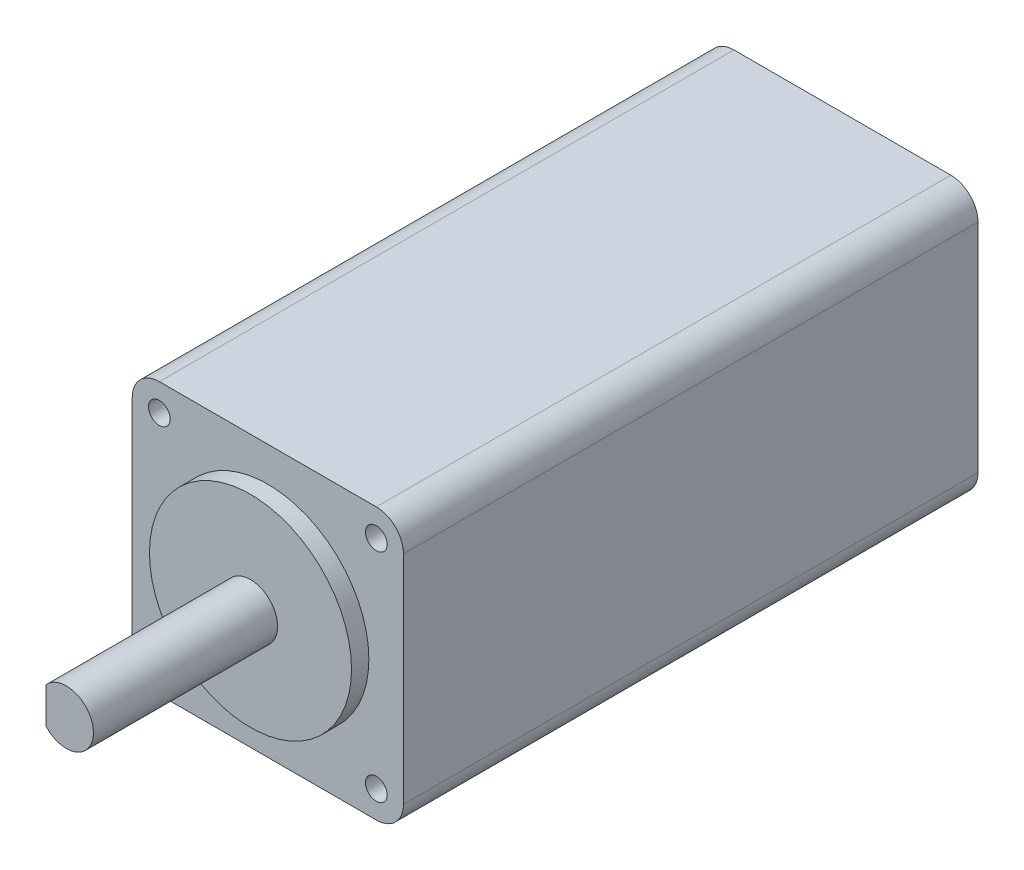
ISO-10303-21;
HEADER;
FILE_DESCRIPTION(('STEP AP214'),'2;1');
FILE_NAME('part.step','',(''),(''),'','','');
FILE_SCHEMA(('AUTOMOTIVE_DESIGN { 1 0 10303 214 1 1 1 1 }'));
ENDSEC;
DATA;
#1=APPLICATION_CONTEXT('core data for automotive mechanical design processes');
#2=APPLICATION_PROTOCOL_DEFINITION('international standard','automotive_design',2000,#1);
#3=PRODUCT_CONTEXT('',#1,'mechanical');
#4=PRODUCT('Part','Part','',(#3));
#5=PRODUCT_RELATED_PRODUCT_CATEGORY('part','',(#4));
#6=PRODUCT_DEFINITION_FORMATION('','',#4);
#7=PRODUCT_DEFINITION_CONTEXT('part definition',#1,'design');
#8=PRODUCT_DEFINITION('design','',#6,#7);
#9=PRODUCT_DEFINITION_SHAPE('','',#8);
#10=(LENGTH_UNIT() NAMED_UNIT(*) SI_UNIT(.MILLI.,.METRE.));
#11=(NAMED_UNIT(*) PLANE_ANGLE_UNIT() SI_UNIT($,.RADIAN.));
#12=(NAMED_UNIT(*) SI_UNIT($,.STERADIAN.) SOLID_ANGLE_UNIT());
#13=UNCERTAINTY_MEASURE_WITH_UNIT(LENGTH_MEASURE(1.E-05),#10,'distance_accuracy_value','');
#14=(GEOMETRIC_REPRESENTATION_CONTEXT(3) GLOBAL_UNCERTAINTY_ASSIGNED_CONTEXT((#13)) GLOBAL_UNIT_ASSIGNED_CONTEXT((#10,
#11,#12)) REPRESENTATION_CONTEXT('',''));
#15=CARTESIAN_POINT('',(0.,0.,0.));
#16=DIRECTION('',(0.,0.,1.));
#17=DIRECTION('',(1.,0.,0.));
#18=AXIS2_PLACEMENT_3D('',#15,#16,#17);
#19=CARTESIAN_POINT('',(-10.,-7.99999999999999,42.37));
#20=DIRECTION('',(1.,0.,0.));
#21=DIRECTION('',(0.,0.,-1.));
#22=AXIS2_PLACEMENT_3D('',#19,#20,#21);
#23=PLANE('',#22);
#24=DIRECTION('',(0.,-1.,0.));
#25=VECTOR('',#24,1.);
#26=CARTESIAN_POINT('',(-10.,-7.99999999999999,0.));
#27=LINE('',#26,#25);
#28=CARTESIAN_POINT('',(-10.,7.99999999999999,0.));
#29=VERTEX_POINT('',#28);
#30=CARTESIAN_POINT('',(-10.,-7.99999999999999,0.));
#31=VERTEX_POINT('',#30);
#32=EDGE_CURVE('E254',#29,#31,#27,.T.);
#33=ORIENTED_EDGE('',*,*,#32,.T.);
#34=DIRECTION('',(0.,0.,-1.));
#35=VECTOR('',#34,1.);
#36=CARTESIAN_POINT('',(-10.,-7.99999999999999,42.37));
#37=LINE('',#36,#35);
#38=CARTESIAN_POINT('',(-10.,-7.99999999999999,42.37));
#39=VERTEX_POINT('',#38);
#40=EDGE_CURVE('E264',#39,#31,#37,.T.);
#41=ORIENTED_EDGE('',*,*,#40,.F.);
#42=DIRECTION('',(0.,-1.,0.));
#43=VECTOR('',#42,1.);
#44=CARTESIAN_POINT('',(-10.,-7.99999999999999,42.37));
#45=LINE('',#44,#43);
#46=CARTESIAN_POINT('',(-10.,7.99999999999999,42.37));
#47=VERTEX_POINT('',#46);
#48=EDGE_CURVE('E237',#47,#39,#45,.T.);
#49=ORIENTED_EDGE('',*,*,#48,.F.);
#50=DIRECTION('',(0.,0.,-1.));
#51=VECTOR('',#50,1.);
#52=CARTESIAN_POINT('',(-10.,7.99999999999999,42.37));
#53=LINE('',#52,#51);
#54=EDGE_CURVE('E267',#47,#29,#53,.T.);
#55=ORIENTED_EDGE('',*,*,#54,.T.);
#56=EDGE_LOOP('',(#33,#41,#49,#55));
#57=FACE_BOUND('',#56,.T.);
#58=DIRECTION('',(0.,-1.,0.));
#59=VECTOR('',#58,1.);
#60=CARTESIAN_POINT('',(-10.,5.8,3.));
#61=LINE('',#60,#59);
#62=CARTESIAN_POINT('',(-10.,5.8,3.));
#63=VERTEX_POINT('',#62);
#64=CARTESIAN_POINT('',(-10.,-5.8,3.));
#65=VERTEX_POINT('',#64);
#66=EDGE_CURVE('E178',#63,#65,#61,.T.);
#67=ORIENTED_EDGE('',*,*,#66,.F.);
#68=DIRECTION('',(0.,0.,-1.));
#69=VECTOR('',#68,1.);
#70=CARTESIAN_POINT('',(-10.,5.8,3.));
#71=LINE('',#70,#69);
#72=CARTESIAN_POINT('',(-10.,5.8,7.9));
#73=VERTEX_POINT('',#72);
#74=EDGE_CURVE('E183',#73,#63,#71,.T.);
#75=ORIENTED_EDGE('',*,*,#74,.F.);
#76=DIRECTION('',(0.,1.,0.));
#77=VECTOR('',#76,1.);
#78=CARTESIAN_POINT('',(-10.,5.8,7.9));
#79=LINE('',#78,#77);
#80=CARTESIAN_POINT('',(-10.,-5.8,7.9));
#81=VERTEX_POINT('',#80);
#82=EDGE_CURVE('E56',#81,#73,#79,.T.);
#83=ORIENTED_EDGE('',*,*,#82,.F.);
#84=DIRECTION('',(0.,0.,1.));
#85=VECTOR('',#84,1.);
#86=CARTESIAN_POINT('',(-10.,-5.8,3.));
#87=LINE('',#86,#85);
#88=EDGE_CURVE('E51',#65,#81,#87,.T.);
#89=ORIENTED_EDGE('',*,*,#88,.F.);
#90=EDGE_LOOP('',(#67,#75,#83,#89));
#91=FACE_BOUND('',#90,.T.);
#92=ADVANCED_FACE('F36',(#57,#91),#23,.F.);
#93=CARTESIAN_POINT('',(0.,0.,43.65));
#94=DIRECTION('',(0.,0.,1.));
#95=DIRECTION('',(1.,0.,0.));
#96=AXIS2_PLACEMENT_3D('',#93,#94,#95);
#97=PLANE('',#96);
#98=CARTESIAN_POINT('',(0.,0.,43.65));
#99=DIRECTION('',(0.,0.,1.));
#100=DIRECTION('',(1.,0.,0.));
#101=AXIS2_PLACEMENT_3D('',#98,#99,#100);
#102=CIRCLE('',#101,7.45);
#103=CARTESIAN_POINT('',(-7.45,0.,43.65));
#104=VERTEX_POINT('',#103);
#105=EDGE_CURVE('E221',#104,#104,#102,.T.);
#106=ORIENTED_EDGE('',*,*,#105,.T.);
#107=EDGE_LOOP('',(#106));
#108=FACE_BOUND('',#107,.T.);
#109=DIRECTION('',(0.,-1.,0.));
#110=VECTOR('',#109,1.);
#111=CARTESIAN_POINT('',(-1.5,1.3228756555323,43.65));
#112=LINE('',#111,#110);
#113=CARTESIAN_POINT('',(-1.5,1.3228756555323,43.65));
#114=VERTEX_POINT('',#113);
#115=CARTESIAN_POINT('',(-1.5,-1.3228756555323,43.65));
#116=VERTEX_POINT('',#115);
#117=EDGE_CURVE('E211',#114,#116,#112,.T.);
#118=ORIENTED_EDGE('',*,*,#117,.F.);
#119=CARTESIAN_POINT('',(0.,0.,43.65));
#120=DIRECTION('',(0.,0.,1.));
#121=DIRECTION('',(1.,0.,0.));
#122=AXIS2_PLACEMENT_3D('',#119,#120,#121);
#123=CIRCLE('',#122,2.);
#124=EDGE_CURVE('E206',#116,#114,#123,.T.);
#125=ORIENTED_EDGE('',*,*,#124,.F.);
#126=EDGE_LOOP('',(#118,#125));
#127=FACE_BOUND('',#126,.T.);
#128=ADVANCED_FACE('F330',(#108,#127),#97,.T.);
#129=CARTESIAN_POINT('',(8.,-8.,42.37));
#130=DIRECTION('',(0.,0.,-1.));
#131=DIRECTION('',(-1.,0.,0.));
#132=AXIS2_PLACEMENT_3D('',#129,#130,#131);
#133=PLANE('',#132);
#134=CARTESIAN_POINT('',(-8.,-8.,42.37));
#135=DIRECTION('',(0.,0.,1.));
#136=DIRECTION('',(1.,0.,0.));
#137=AXIS2_PLACEMENT_3D('',#134,#135,#136);
#138=CIRCLE('',#137,0.79999999999999);
#139=CARTESIAN_POINT('',(-7.20000000000001,-8.,42.37));
#140=VERTEX_POINT('',#139);
#141=EDGE_CURVE('E156',#140,#140,#138,.T.);
#142=ORIENTED_EDGE('',*,*,#141,.F.);
#143=EDGE_LOOP('',(#142));
#144=FACE_BOUND('',#143,.T.);
#145=CARTESIAN_POINT('',(8.,-8.,42.37));
#146=DIRECTION('',(0.,0.,1.));
#147=DIRECTION('',(1.,0.,0.));
#148=AXIS2_PLACEMENT_3D('',#145,#146,#147);
#149=CIRCLE('',#148,0.79999999999999);
#150=CARTESIAN_POINT('',(8.79999999999999,-8.,42.37));
#151=VERTEX_POINT('',#150);
#152=EDGE_CURVE('E155',#151,#151,#149,.T.);
#153=ORIENTED_EDGE('',*,*,#152,.F.);
#154=EDGE_LOOP('',(#153));
#155=FACE_BOUND('',#154,.T.);
#156=CARTESIAN_POINT('',(8.,8.,42.37));
#157=DIRECTION('',(0.,0.,1.));
#158=DIRECTION('',(1.,0.,0.));
#159=AXIS2_PLACEMENT_3D('',#156,#157,#158);
#160=CIRCLE('',#159,0.79999999999999);
#161=CARTESIAN_POINT('',(8.79999999999999,8.,42.37));
#162=VERTEX_POINT('',#161);
#163=EDGE_CURVE('E166',#162,#162,#160,.T.);
#164=ORIENTED_EDGE('',*,*,#163,.F.);
#165=EDGE_LOOP('',(#164));
#166=FACE_BOUND('',#165,.T.);
#167=CARTESIAN_POINT('',(-8.,8.,42.37));
#168=DIRECTION('',(0.,0.,1.));
#169=DIRECTION('',(1.,0.,0.));
#170=AXIS2_PLACEMENT_3D('',#167,#168,#169);
#171=CIRCLE('',#170,0.79999999999999);
#172=CARTESIAN_POINT('',(-7.20000000000001,8.,42.37));
#173=VERTEX_POINT('',#172);
#174=EDGE_CURVE('E172',#173,#173,#171,.T.);
#175=ORIENTED_EDGE('',*,*,#174,.F.);
#176=EDGE_LOOP('',(#175));
#177=FACE_BOUND('',#176,.T.);
#178=CARTESIAN_POINT('',(8.,-8.,42.37));
#179=DIRECTION('',(0.,0.,1.));
#180=DIRECTION('',(-1.,0.,0.));
#181=AXIS2_PLACEMENT_3D('',#178,#179,#180);
#182=CIRCLE('',#181,2.);
#183=CARTESIAN_POINT('',(7.99999999999998,-10.,42.37));
#184=VERTEX_POINT('',#183);
#185=CARTESIAN_POINT('',(10.,-7.99999999999999,42.37));
#186=VERTEX_POINT('',#185);
#187=EDGE_CURVE('E225',#184,#186,#182,.T.);
#188=ORIENTED_EDGE('',*,*,#187,.T.);
#189=DIRECTION('',(0.,1.,0.));
#190=VECTOR('',#189,1.);
#191=CARTESIAN_POINT('',(10.,-7.99999999999999,42.37));
#192=LINE('',#191,#190);
#193=CARTESIAN_POINT('',(10.,7.99999999999999,42.37));
#194=VERTEX_POINT('',#193);
#195=EDGE_CURVE('E228',#186,#194,#192,.T.);
#196=ORIENTED_EDGE('',*,*,#195,.T.);
#197=CARTESIAN_POINT('',(8.,8.,42.37));
#198=DIRECTION('',(0.,0.,1.));
#199=DIRECTION('',(1.,0.,0.));
#200=AXIS2_PLACEMENT_3D('',#197,#198,#199);
#201=CIRCLE('',#200,2.);
#202=CARTESIAN_POINT('',(7.99999999999998,10.,42.37));
#203=VERTEX_POINT('',#202);
#204=EDGE_CURVE('E231',#194,#203,#201,.T.);
#205=ORIENTED_EDGE('',*,*,#204,.T.);
#206=DIRECTION('',(-1.,0.,0.));
#207=VECTOR('',#206,1.);
#208=CARTESIAN_POINT('',(-7.99999999999999,10.,42.37));
#209=LINE('',#208,#207);
#210=CARTESIAN_POINT('',(-7.99999999999999,10.,42.37));
#211=VERTEX_POINT('',#210);
#212=EDGE_CURVE('E233',#203,#211,#209,.T.);
#213=ORIENTED_EDGE('',*,*,#212,.T.);
#214=CARTESIAN_POINT('',(-8.,8.,42.37));
#215=DIRECTION('',(0.,0.,1.));
#216=DIRECTION('',(1.,0.,0.));
#217=AXIS2_PLACEMENT_3D('',#214,#215,#216);
#218=CIRCLE('',#217,2.);
#219=EDGE_CURVE('E235',#211,#47,#218,.T.);
#220=ORIENTED_EDGE('',*,*,#219,.T.);
#221=ORIENTED_EDGE('',*,*,#48,.T.);
#222=CARTESIAN_POINT('',(-8.,-8.,42.37));
#223=DIRECTION('',(0.,0.,1.));
#224=DIRECTION('',(1.,0.,0.));
#225=AXIS2_PLACEMENT_3D('',#222,#223,#224);
#226=CIRCLE('',#225,2.);
#227=CARTESIAN_POINT('',(-7.99999999999999,-10.,42.37));
#228=VERTEX_POINT('',#227);
#229=EDGE_CURVE('E239',#39,#228,#226,.T.);
#230=ORIENTED_EDGE('',*,*,#229,.T.);
#231=DIRECTION('',(1.,0.,0.));
#232=VECTOR('',#231,1.);
#233=CARTESIAN_POINT('',(-7.99999999999999,-10.,42.37));
#234=LINE('',#233,#232);
#235=EDGE_CURVE('E241',#228,#184,#234,.T.);
#236=ORIENTED_EDGE('',*,*,#235,.T.);
#237=EDGE_LOOP('',(#188,#196,#205,#213,#220,#221,#230,#236));
#238=FACE_BOUND('',#237,.T.);
#239=CARTESIAN_POINT('',(0.,0.,42.37));
#240=DIRECTION('',(0.,0.,-1.));
#241=DIRECTION('',(-1.,0.,0.));
#242=AXIS2_PLACEMENT_3D('',#239,#240,#241);
#243=CIRCLE('',#242,7.45);
#244=CARTESIAN_POINT('',(-7.45,0.,42.37));
#245=VERTEX_POINT('',#244);
#246=EDGE_CURVE('E11',#245,#245,#243,.F.);
#247=ORIENTED_EDGE('',*,*,#246,.F.);
#248=EDGE_LOOP('',(#247));
#249=FACE_BOUND('',#248,.T.);
#250=ADVANCED_FACE('F304',(#144,#155,#166,#177,#238,#249),#133,.F.);
#251=CARTESIAN_POINT('',(8.,-8.,42.37));
#252=DIRECTION('',(0.,0.,-1.));
#253=DIRECTION('',(-1.,0.,0.));
#254=AXIS2_PLACEMENT_3D('',#251,#252,#253);
#255=CYLINDRICAL_SURFACE('',#254,2.);
#256=CARTESIAN_POINT('',(8.,-8.,0.));
#257=DIRECTION('',(0.,0.,1.));
#258=DIRECTION('',(-1.,0.,0.));
#259=AXIS2_PLACEMENT_3D('',#256,#257,#258);
#260=CIRCLE('',#259,2.);
#261=CARTESIAN_POINT('',(7.99999999999998,-10.,0.));
#262=VERTEX_POINT('',#261);
#263=CARTESIAN_POINT('',(10.,-7.99999999999999,0.));
#264=VERTEX_POINT('',#263);
#265=EDGE_CURVE('E224',#262,#264,#260,.T.);
#266=ORIENTED_EDGE('',*,*,#265,.T.);
#267=DIRECTION('',(0.,0.,-1.));
#268=VECTOR('',#267,1.);
#269=CARTESIAN_POINT('',(10.,-7.99999999999999,42.37));
#270=LINE('',#269,#268);
#271=EDGE_CURVE('E44',#186,#264,#270,.T.);
#272=ORIENTED_EDGE('',*,*,#271,.F.);
#273=ORIENTED_EDGE('',*,*,#187,.F.);
#274=DIRECTION('',(0.,0.,-1.));
#275=VECTOR('',#274,1.);
#276=CARTESIAN_POINT('',(7.99999999999998,-10.,42.37));
#277=LINE('',#276,#275);
#278=EDGE_CURVE('E243',#184,#262,#277,.T.);
#279=ORIENTED_EDGE('',*,*,#278,.T.);
#280=EDGE_LOOP('',(#266,#272,#273,#279));
#281=FACE_BOUND('',#280,.T.);
#282=ADVANCED_FACE('F38',(#281),#255,.T.);
#283=CARTESIAN_POINT('',(10.,-7.99999999999999,42.37));
#284=DIRECTION('',(-1.,0.,0.));
#285=DIRECTION('',(0.,0.,1.));
#286=AXIS2_PLACEMENT_3D('',#283,#284,#285);
#287=PLANE('',#286);
#288=DIRECTION('',(0.,1.,0.));
#289=VECTOR('',#288,1.);
#290=CARTESIAN_POINT('',(10.,-7.99999999999999,0.));
#291=LINE('',#290,#289);
#292=CARTESIAN_POINT('',(10.,7.99999999999999,0.));
#293=VERTEX_POINT('',#292);
#294=EDGE_CURVE('E246',#264,#293,#291,.T.);
#295=ORIENTED_EDGE('',*,*,#294,.T.);
#296=DIRECTION('',(0.,0.,-1.));
#297=VECTOR('',#296,1.);
#298=CARTESIAN_POINT('',(10.,7.99999999999999,42.37));
#299=LINE('',#298,#297);
#300=EDGE_CURVE('E276',#194,#293,#299,.T.);
#301=ORIENTED_EDGE('',*,*,#300,.F.);
#302=ORIENTED_EDGE('',*,*,#195,.F.);
#303=ORIENTED_EDGE('',*,*,#271,.T.);
#304=EDGE_LOOP('',(#295,#301,#302,#303));
#305=FACE_BOUND('',#304,.T.);
#306=ADVANCED_FACE('F281',(#305),#287,.F.);
#307=CARTESIAN_POINT('',(8.,8.,42.37));
#308=DIRECTION('',(0.,0.,-1.));
#309=DIRECTION('',(-1.,0.,0.));
#310=AXIS2_PLACEMENT_3D('',#307,#308,#309);
#311=CYLINDRICAL_SURFACE('',#310,2.);
#312=CARTESIAN_POINT('',(8.,8.,0.));
#313=DIRECTION('',(0.,0.,1.));
#314=DIRECTION('',(1.,0.,0.));
#315=AXIS2_PLACEMENT_3D('',#312,#313,#314);
#316=CIRCLE('',#315,2.);
#317=CARTESIAN_POINT('',(7.99999999999998,10.,0.));
#318=VERTEX_POINT('',#317);
#319=EDGE_CURVE('E248',#293,#318,#316,.T.);
#320=ORIENTED_EDGE('',*,*,#319,.T.);
#321=DIRECTION('',(0.,0.,-1.));
#322=VECTOR('',#321,1.);
#323=CARTESIAN_POINT('',(7.99999999999998,10.,42.37));
#324=LINE('',#323,#322);
#325=EDGE_CURVE('E273',#203,#318,#324,.T.);
#326=ORIENTED_EDGE('',*,*,#325,.F.);
#327=ORIENTED_EDGE('',*,*,#204,.F.);
#328=ORIENTED_EDGE('',*,*,#300,.T.);
#329=EDGE_LOOP('',(#320,#326,#327,#328));
#330=FACE_BOUND('',#329,.T.);
#331=ADVANCED_FACE('F296',(#330),#311,.T.);
#332=CARTESIAN_POINT('',(-7.99999999999999,10.,42.37));
#333=DIRECTION('',(0.,-1.,0.));
#334=DIRECTION('',(0.,0.,-1.));
#335=AXIS2_PLACEMENT_3D('',#332,#333,#334);
#336=PLANE('',#335);
#337=DIRECTION('',(-1.,0.,0.));
#338=VECTOR('',#337,1.);
#339=CARTESIAN_POINT('',(-7.99999999999999,10.,0.));
#340=LINE('',#339,#338);
#341=CARTESIAN_POINT('',(-7.99999999999999,10.,0.));
#342=VERTEX_POINT('',#341);
#343=EDGE_CURVE('E250',#318,#342,#340,.T.);
#344=ORIENTED_EDGE('',*,*,#343,.T.);
#345=DIRECTION('',(0.,0.,-1.));
#346=VECTOR('',#345,1.);
#347=CARTESIAN_POINT('',(-7.99999999999999,10.,42.37));
#348=LINE('',#347,#346);
#349=EDGE_CURVE('E270',#211,#342,#348,.T.);
#350=ORIENTED_EDGE('',*,*,#349,.F.);
#351=ORIENTED_EDGE('',*,*,#212,.F.);
#352=ORIENTED_EDGE('',*,*,#325,.T.);
#353=EDGE_LOOP('',(#344,#350,#351,#352));
#354=FACE_BOUND('',#353,.T.);
#355=ADVANCED_FACE('F300',(#354),#336,.F.);
#356=CARTESIAN_POINT('',(-8.,8.,42.37));
#357=DIRECTION('',(0.,0.,-1.));
#358=DIRECTION('',(-1.,0.,0.));
#359=AXIS2_PLACEMENT_3D('',#356,#357,#358);
#360=CYLINDRICAL_SURFACE('',#359,2.);
#361=CARTESIAN_POINT('',(-8.,8.,0.));
#362=DIRECTION('',(0.,0.,1.));
#363=DIRECTION('',(1.,0.,0.));
#364=AXIS2_PLACEMENT_3D('',#361,#362,#363);
#365=CIRCLE('',#364,2.);
#366=EDGE_CURVE('E252',#342,#29,#365,.T.);
#367=ORIENTED_EDGE('',*,*,#366,.T.);
#368=ORIENTED_EDGE('',*,*,#54,.F.);
#369=ORIENTED_EDGE('',*,*,#219,.F.);
#370=ORIENTED_EDGE('',*,*,#349,.T.);
#371=EDGE_LOOP('',(#367,#368,#369,#370));
#372=FACE_BOUND('',#371,.T.);
#373=ADVANCED_FACE('F319',(#372),#360,.T.);
#374=CARTESIAN_POINT('',(-8.,-8.,42.37));
#375=DIRECTION('',(0.,0.,-1.));
#376=DIRECTION('',(-1.,0.,0.));
#377=AXIS2_PLACEMENT_3D('',#374,#375,#376);
#378=CYLINDRICAL_SURFACE('',#377,2.);
#379=CARTESIAN_POINT('',(-8.,-8.,0.));
#380=DIRECTION('',(0.,0.,1.));
#381=DIRECTION('',(1.,0.,0.));
#382=AXIS2_PLACEMENT_3D('',#379,#380,#381);
#383=CIRCLE('',#382,2.);
#384=CARTESIAN_POINT('',(-7.99999999999999,-10.,0.));
#385=VERTEX_POINT('',#384);
#386=EDGE_CURVE('E256',#31,#385,#383,.T.);
#387=ORIENTED_EDGE('',*,*,#386,.T.);
#388=DIRECTION('',(0.,0.,-1.));
#389=VECTOR('',#388,1.);
#390=CARTESIAN_POINT('',(-7.99999999999999,-10.,42.37));
#391=LINE('',#390,#389);
#392=EDGE_CURVE('E261',#228,#385,#391,.T.);
#393=ORIENTED_EDGE('',*,*,#392,.F.);
#394=ORIENTED_EDGE('',*,*,#229,.F.);
#395=ORIENTED_EDGE('',*,*,#40,.T.);
#396=EDGE_LOOP('',(#387,#393,#394,#395));
#397=FACE_BOUND('',#396,.T.);
#398=ADVANCED_FACE('F313',(#397),#378,.T.);
#399=CARTESIAN_POINT('',(-7.99999999999999,-10.,42.37));
#400=DIRECTION('',(0.,1.,0.));
#401=DIRECTION('',(0.,0.,1.));
#402=AXIS2_PLACEMENT_3D('',#399,#400,#401);
#403=PLANE('',#402);
#404=DIRECTION('',(1.,0.,0.));
#405=VECTOR('',#404,1.);
#406=CARTESIAN_POINT('',(-7.99999999999999,-10.,0.));
#407=LINE('',#406,#405);
#408=EDGE_CURVE('E229',#385,#262,#407,.T.);
#409=ORIENTED_EDGE('',*,*,#408,.T.);
#410=ORIENTED_EDGE('',*,*,#278,.F.);
#411=ORIENTED_EDGE('',*,*,#235,.F.);
#412=ORIENTED_EDGE('',*,*,#392,.T.);
#413=EDGE_LOOP('',(#409,#410,#411,#412));
#414=FACE_BOUND('',#413,.T.);
#415=ADVANCED_FACE('F311',(#414),#403,.F.);
#416=CARTESIAN_POINT('',(8.,-8.,0.));
#417=DIRECTION('',(0.,0.,-1.));
#418=DIRECTION('',(-1.,0.,0.));
#419=AXIS2_PLACEMENT_3D('',#416,#417,#418);
#420=PLANE('',#419);
#421=ORIENTED_EDGE('',*,*,#265,.F.);
#422=ORIENTED_EDGE('',*,*,#408,.F.);
#423=ORIENTED_EDGE('',*,*,#386,.F.);
#424=ORIENTED_EDGE('',*,*,#32,.F.);
#425=ORIENTED_EDGE('',*,*,#366,.F.);
#426=ORIENTED_EDGE('',*,*,#343,.F.);
#427=ORIENTED_EDGE('',*,*,#319,.F.);
#428=ORIENTED_EDGE('',*,*,#294,.F.);
#429=EDGE_LOOP('',(#421,#422,#423,#424,#425,#426,#427,#428));
#430=FACE_BOUND('',#429,.T.);
#431=ADVANCED_FACE('F289',(#430),#420,.T.);
#432=CARTESIAN_POINT('',(0.,0.,43.65));
#433=DIRECTION('',(0.,0.,-1.));
#434=DIRECTION('',(-1.,0.,0.));
#435=AXIS2_PLACEMENT_3D('',#432,#433,#434);
#436=CYLINDRICAL_SURFACE('',#435,7.45);
#437=CARTESIAN_POINT('',(-7.45,0.,43.65));
#438=CARTESIAN_POINT('',(-7.45,0.,43.6366666666667));
#439=CARTESIAN_POINT('',(-7.45,0.,43.6233333333333));
#440=CARTESIAN_POINT('',(-7.45,0.,43.5966666666667));
#441=CARTESIAN_POINT('',(-7.45,0.,43.5833333333333));
#442=CARTESIAN_POINT('',(-7.45,0.,43.5566666666667));
#443=CARTESIAN_POINT('',(-7.45,0.,43.5433333333333));
#444=CARTESIAN_POINT('',(-7.45,0.,43.5166666666667));
#445=CARTESIAN_POINT('',(-7.45,0.,43.5033333333333));
#446=CARTESIAN_POINT('',(-7.45,0.,43.4766666666667));
#447=CARTESIAN_POINT('',(-7.45,0.,43.4633333333333));
#448=CARTESIAN_POINT('',(-7.45,0.,43.4366666666667));
#449=CARTESIAN_POINT('',(-7.45,0.,43.4233333333333));
#450=CARTESIAN_POINT('',(-7.45,0.,43.3966666666667));
#451=CARTESIAN_POINT('',(-7.45,0.,43.3833333333333));
#452=CARTESIAN_POINT('',(-7.45,0.,43.3566666666667));
#453=CARTESIAN_POINT('',(-7.45,0.,43.3433333333333));
#454=CARTESIAN_POINT('',(-7.45,0.,43.3166666666667));
#455=CARTESIAN_POINT('',(-7.45,0.,43.3033333333333));
#456=CARTESIAN_POINT('',(-7.45,0.,43.2766666666667));
#457=CARTESIAN_POINT('',(-7.45,0.,43.2633333333333));
#458=CARTESIAN_POINT('',(-7.45,0.,43.2366666666667));
#459=CARTESIAN_POINT('',(-7.45,0.,43.2233333333333));
#460=CARTESIAN_POINT('',(-7.45,0.,43.1966666666667));
#461=CARTESIAN_POINT('',(-7.45,0.,43.1833333333333));
#462=CARTESIAN_POINT('',(-7.45,0.,43.1566666666667));
#463=CARTESIAN_POINT('',(-7.45,0.,43.1433333333333));
#464=CARTESIAN_POINT('',(-7.45,0.,43.1166666666667));
#465=CARTESIAN_POINT('',(-7.45,0.,43.1033333333333));
#466=CARTESIAN_POINT('',(-7.45,0.,43.0766666666667));
#467=CARTESIAN_POINT('',(-7.45,0.,43.0633333333333));
#468=CARTESIAN_POINT('',(-7.45,0.,43.0366666666667));
#469=CARTESIAN_POINT('',(-7.45,0.,43.0233333333333));
#470=CARTESIAN_POINT('',(-7.45,0.,42.9966666666667));
#471=CARTESIAN_POINT('',(-7.45,0.,42.9833333333333));
#472=CARTESIAN_POINT('',(-7.45,0.,42.9566666666667));
#473=CARTESIAN_POINT('',(-7.45,0.,42.9433333333333));
#474=CARTESIAN_POINT('',(-7.45,0.,42.9166666666667));
#475=CARTESIAN_POINT('',(-7.45,0.,42.9033333333333));
#476=CARTESIAN_POINT('',(-7.45,0.,42.8766666666667));
#477=CARTESIAN_POINT('',(-7.45,0.,42.8633333333333));
#478=CARTESIAN_POINT('',(-7.45,0.,42.8366666666667));
#479=CARTESIAN_POINT('',(-7.45,0.,42.8233333333333));
#480=CARTESIAN_POINT('',(-7.45,0.,42.7966666666667));
#481=CARTESIAN_POINT('',(-7.45,0.,42.7833333333333));
#482=CARTESIAN_POINT('',(-7.45,0.,42.7566666666667));
#483=CARTESIAN_POINT('',(-7.45,0.,42.7433333333333));
#484=CARTESIAN_POINT('',(-7.45,0.,42.7166666666667));
#485=CARTESIAN_POINT('',(-7.45,0.,42.7033333333333));
#486=CARTESIAN_POINT('',(-7.45,0.,42.6766666666667));
#487=CARTESIAN_POINT('',(-7.45,0.,42.6633333333333));
#488=CARTESIAN_POINT('',(-7.45,0.,42.6366666666667));
#489=CARTESIAN_POINT('',(-7.45,0.,42.6233333333333));
#490=CARTESIAN_POINT('',(-7.45,0.,42.5966666666667));
#491=CARTESIAN_POINT('',(-7.45,0.,42.5833333333333));
#492=CARTESIAN_POINT('',(-7.45,0.,42.5566666666667));
#493=CARTESIAN_POINT('',(-7.45,0.,42.5433333333333));
#494=CARTESIAN_POINT('',(-7.45,0.,42.5166666666667));
#495=CARTESIAN_POINT('',(-7.45,0.,42.5033333333333));
#496=CARTESIAN_POINT('',(-7.45,0.,42.4766666666667));
#497=CARTESIAN_POINT('',(-7.45,0.,42.4633333333333));
#498=CARTESIAN_POINT('',(-7.45,0.,42.4366666666667));
#499=CARTESIAN_POINT('',(-7.45,0.,42.4233333333333));
#500=CARTESIAN_POINT('',(-7.45,0.,42.3966666666667));
#501=CARTESIAN_POINT('',(-7.45,0.,42.3833333333333));
#502=CARTESIAN_POINT('',(-7.45,0.,42.37));
#503=B_SPLINE_CURVE_WITH_KNOTS('',3,(#437,#438,#439,#440,#441,#442,#443,#444,#445,#446,#447,
#448,#449,#450,#451,#452,#453,#454,#455,#456,#457,#458,#459,#460,#461,#462,#463,#464,#465,#466,
#467,#468,#469,#470,#471,#472,#473,#474,#475,#476,#477,#478,#479,#480,#481,#482,#483,#484,#485,
#486,#487,#488,#489,#490,#491,#492,#493,#494,#495,#496,#497,#498,#499,#500,#501,#502),
.UNSPECIFIED.,.F.,.F.,(4,2,2,2,2,2,2,2,2,2,2,2,2,2,2,2,2,2,2,2,2,2,2,2,2,2,2,2,2,2,2,2,4),(0.,
0.0400000000000053,0.0800000000000037,0.120000000000002,0.16,0.200000000000006,
0.240000000000004,0.280000000000002,0.320000000000001,0.359999999999999,0.400000000000005,
0.440000000000003,0.480000000000001,0.52,0.560000000000005,0.600000000000003,0.640000000000002,
0.68,0.719999999999998,0.760000000000004,0.800000000000002,0.840000000000001,0.879999999999999,
0.920000000000004,0.960000000000003,1.,1.04,1.08,1.12,1.16,1.2,1.24,1.28),.UNSPECIFIED.);
#504=EDGE_CURVE('BSEAM341',#104,#245,#503,.T.);
#505=ORIENTED_EDGE('',*,*,#105,.F.);
#506=ORIENTED_EDGE('',*,*,#246,.T.);
#507=ORIENTED_EDGE('',*,*,#504,.T.);
#508=ORIENTED_EDGE('',*,*,#504,.F.);
#509=EDGE_LOOP('',(#505,#507,#506,#508));
#510=FACE_BOUND('',#509,.T.);
#511=ADVANCED_FACE('F341',(#510),#436,.T.);
#512=CARTESIAN_POINT('',(0.,0.,57.23));
#513=DIRECTION('',(0.,0.,-1.));
#514=DIRECTION('',(-1.,0.,0.));
#515=AXIS2_PLACEMENT_3D('',#512,#513,#514);
#516=CYLINDRICAL_SURFACE('',#515,2.);
#517=ORIENTED_EDGE('',*,*,#124,.T.);
#518=DIRECTION('',(0.,0.,-1.));
#519=VECTOR('',#518,1.);
#520=CARTESIAN_POINT('',(-1.5,1.3228756555323,57.23));
#521=LINE('',#520,#519);
#522=CARTESIAN_POINT('',(-1.5,1.3228756555323,57.23));
#523=VERTEX_POINT('',#522);
#524=EDGE_CURVE('E218',#523,#114,#521,.T.);
#525=ORIENTED_EDGE('',*,*,#524,.F.);
#526=CARTESIAN_POINT('',(0.,0.,57.23));
#527=DIRECTION('',(0.,0.,1.));
#528=DIRECTION('',(1.,0.,0.));
#529=AXIS2_PLACEMENT_3D('',#526,#527,#528);
#530=CIRCLE('',#529,2.);
#531=CARTESIAN_POINT('',(-1.5,-1.3228756555323,57.23));
#532=VERTEX_POINT('',#531);
#533=EDGE_CURVE('E207',#532,#523,#530,.T.);
#534=ORIENTED_EDGE('',*,*,#533,.F.);
#535=DIRECTION('',(0.,0.,-1.));
#536=VECTOR('',#535,1.);
#537=CARTESIAN_POINT('',(-1.5,-1.3228756555323,57.23));
#538=LINE('',#537,#536);
#539=EDGE_CURVE('E213',#532,#116,#538,.T.);
#540=ORIENTED_EDGE('',*,*,#539,.T.);
#541=EDGE_LOOP('',(#517,#525,#534,#540));
#542=FACE_BOUND('',#541,.T.);
#543=ADVANCED_FACE('F346',(#542),#516,.T.);
#544=CARTESIAN_POINT('',(-1.5,1.3228756555323,57.23));
#545=DIRECTION('',(1.,0.,0.));
#546=DIRECTION('',(0.,1.,0.));
#547=AXIS2_PLACEMENT_3D('',#544,#545,#546);
#548=PLANE('',#547);
#549=ORIENTED_EDGE('',*,*,#117,.T.);
#550=ORIENTED_EDGE('',*,*,#539,.F.);
#551=DIRECTION('',(0.,-1.,0.));
#552=VECTOR('',#551,1.);
#553=CARTESIAN_POINT('',(-1.5,1.3228756555323,57.23));
#554=LINE('',#553,#552);
#555=EDGE_CURVE('E210',#523,#532,#554,.T.);
#556=ORIENTED_EDGE('',*,*,#555,.F.);
#557=ORIENTED_EDGE('',*,*,#524,.T.);
#558=EDGE_LOOP('',(#549,#550,#556,#557));
#559=FACE_BOUND('',#558,.T.);
#560=ADVANCED_FACE('F351',(#559),#548,.F.);
#561=CARTESIAN_POINT('',(0.,0.,57.23));
#562=DIRECTION('',(0.,0.,1.));
#563=DIRECTION('',(1.,0.,0.));
#564=AXIS2_PLACEMENT_3D('',#561,#562,#563);
#565=PLANE('',#564);
#566=ORIENTED_EDGE('',*,*,#533,.T.);
#567=ORIENTED_EDGE('',*,*,#555,.T.);
#568=EDGE_LOOP('',(#566,#567));
#569=FACE_BOUND('',#568,.T.);
#570=ADVANCED_FACE('F355',(#569),#565,.T.);
#571=CARTESIAN_POINT('',(-13.,5.8,3.));
#572=DIRECTION('',(0.,0.,1.));
#573=DIRECTION('',(0.,-1.,0.));
#574=AXIS2_PLACEMENT_3D('',#571,#572,#573);
#575=PLANE('',#574);
#576=ORIENTED_EDGE('',*,*,#66,.T.);
#577=DIRECTION('',(1.,0.,0.));
#578=VECTOR('',#577,1.);
#579=CARTESIAN_POINT('',(-13.,-5.8,3.));
#580=LINE('',#579,#578);
#581=CARTESIAN_POINT('',(-13.,-5.8,3.));
#582=VERTEX_POINT('',#581);
#583=EDGE_CURVE('E204',#582,#65,#580,.T.);
#584=ORIENTED_EDGE('',*,*,#583,.F.);
#585=DIRECTION('',(0.,-1.,0.));
#586=VECTOR('',#585,1.);
#587=CARTESIAN_POINT('',(-13.,5.8,3.));
#588=LINE('',#587,#586);
#589=CARTESIAN_POINT('',(-13.,5.8,3.));
#590=VERTEX_POINT('',#589);
#591=EDGE_CURVE('E179',#590,#582,#588,.T.);
#592=ORIENTED_EDGE('',*,*,#591,.F.);
#593=DIRECTION('',(1.,0.,0.));
#594=VECTOR('',#593,1.);
#595=CARTESIAN_POINT('',(-13.,5.8,3.));
#596=LINE('',#595,#594);
#597=EDGE_CURVE('E189',#590,#63,#596,.T.);
#598=ORIENTED_EDGE('',*,*,#597,.T.);
#599=EDGE_LOOP('',(#576,#584,#592,#598));
#600=FACE_BOUND('',#599,.T.);
#601=ADVANCED_FACE('F359',(#600),#575,.F.);
#602=CARTESIAN_POINT('',(-13.,-5.8,3.));
#603=DIRECTION('',(0.,1.,0.));
#604=DIRECTION('',(0.,0.,1.));
#605=AXIS2_PLACEMENT_3D('',#602,#603,#604);
#606=PLANE('',#605);
#607=ORIENTED_EDGE('',*,*,#88,.T.);
#608=DIRECTION('',(1.,0.,0.));
#609=VECTOR('',#608,1.);
#610=CARTESIAN_POINT('',(-13.,-5.8,7.9));
#611=LINE('',#610,#609);
#612=CARTESIAN_POINT('',(-13.,-5.8,7.9));
#613=VERTEX_POINT('',#612);
#614=EDGE_CURVE('E201',#613,#81,#611,.T.);
#615=ORIENTED_EDGE('',*,*,#614,.F.);
#616=DIRECTION('',(0.,0.,1.));
#617=VECTOR('',#616,1.);
#618=CARTESIAN_POINT('',(-13.,-5.8,3.));
#619=LINE('',#618,#617);
#620=EDGE_CURVE('E182',#582,#613,#619,.T.);
#621=ORIENTED_EDGE('',*,*,#620,.F.);
#622=ORIENTED_EDGE('',*,*,#583,.T.);
#623=EDGE_LOOP('',(#607,#615,#621,#622));
#624=FACE_BOUND('',#623,.T.);
#625=ADVANCED_FACE('F363',(#624),#606,.F.);
#626=CARTESIAN_POINT('',(-13.,5.8,7.9));
#627=DIRECTION('',(0.,0.,-1.));
#628=DIRECTION('',(0.,1.,0.));
#629=AXIS2_PLACEMENT_3D('',#626,#627,#628);
#630=PLANE('',#629);
#631=ORIENTED_EDGE('',*,*,#82,.T.);
#632=DIRECTION('',(1.,0.,0.));
#633=VECTOR('',#632,1.);
#634=CARTESIAN_POINT('',(-13.,5.8,7.9));
#635=LINE('',#634,#633);
#636=CARTESIAN_POINT('',(-13.,5.8,7.9));
#637=VERTEX_POINT('',#636);
#638=EDGE_CURVE('E198',#637,#73,#635,.T.);
#639=ORIENTED_EDGE('',*,*,#638,.F.);
#640=DIRECTION('',(0.,1.,0.));
#641=VECTOR('',#640,1.);
#642=CARTESIAN_POINT('',(-13.,5.8,7.9));
#643=LINE('',#642,#641);
#644=EDGE_CURVE('E185',#613,#637,#643,.T.);
#645=ORIENTED_EDGE('',*,*,#644,.F.);
#646=ORIENTED_EDGE('',*,*,#614,.T.);
#647=EDGE_LOOP('',(#631,#639,#645,#646));
#648=FACE_BOUND('',#647,.T.);
#649=ADVANCED_FACE('F367',(#648),#630,.F.);
#650=CARTESIAN_POINT('',(-13.,5.8,3.));
#651=DIRECTION('',(0.,-1.,0.));
#652=DIRECTION('',(0.,0.,-1.));
#653=AXIS2_PLACEMENT_3D('',#650,#651,#652);
#654=PLANE('',#653);
#655=ORIENTED_EDGE('',*,*,#74,.T.);
#656=ORIENTED_EDGE('',*,*,#597,.F.);
#657=DIRECTION('',(0.,0.,-1.));
#658=VECTOR('',#657,1.);
#659=CARTESIAN_POINT('',(-13.,5.8,3.));
#660=LINE('',#659,#658);
#661=EDGE_CURVE('E187',#637,#590,#660,.T.);
#662=ORIENTED_EDGE('',*,*,#661,.F.);
#663=ORIENTED_EDGE('',*,*,#638,.T.);
#664=EDGE_LOOP('',(#655,#656,#662,#663));
#665=FACE_BOUND('',#664,.T.);
#666=ADVANCED_FACE('F371',(#665),#654,.F.);
#667=CARTESIAN_POINT('',(-13.,0.,0.));
#668=DIRECTION('',(-1.,0.,0.));
#669=DIRECTION('',(0.,0.,1.));
#670=AXIS2_PLACEMENT_3D('',#667,#668,#669);
#671=PLANE('',#670);
#672=ORIENTED_EDGE('',*,*,#591,.T.);
#673=ORIENTED_EDGE('',*,*,#620,.T.);
#674=ORIENTED_EDGE('',*,*,#644,.T.);
#675=ORIENTED_EDGE('',*,*,#661,.T.);
#676=EDGE_LOOP('',(#672,#673,#674,#675));
#677=FACE_BOUND('',#676,.T.);
#678=ADVANCED_FACE('F375',(#677),#671,.T.);
#679=CARTESIAN_POINT('',(-8.,8.,38.37));
#680=DIRECTION('',(0.,0.,1.));
#681=DIRECTION('',(1.,0.,0.));
#682=AXIS2_PLACEMENT_3D('',#679,#680,#681);
#683=CONICAL_SURFACE('',#682,0.799999999999999,1.02974425867665);
#684=CARTESIAN_POINT('',(-8.,8.,37.889311504778));
#685=VERTEX_POINT('',#684);
#686=VERTEX_LOOP('',#685);
#687=FACE_BOUND('',#686,.T.);
#688=CARTESIAN_POINT('',(-8.,8.,38.37));
#689=DIRECTION('',(0.,0.,1.));
#690=DIRECTION('',(1.,0.,0.));
#691=AXIS2_PLACEMENT_3D('',#688,#689,#690);
#692=CIRCLE('',#691,0.799999999999999);
#693=CARTESIAN_POINT('',(-7.2,8.,38.37));
#694=VERTEX_POINT('',#693);
#695=EDGE_CURVE('E175',#694,#694,#692,.T.);
#696=ORIENTED_EDGE('',*,*,#695,.T.);
#697=EDGE_LOOP('',(#696));
#698=FACE_BOUND('',#697,.T.);
#699=ADVANCED_FACE('F379',(#687,#698),#683,.F.);
#700=CARTESIAN_POINT('',(-8.,8.,42.37));
#701=DIRECTION('',(0.,0.,1.));
#702=DIRECTION('',(1.,0.,0.));
#703=AXIS2_PLACEMENT_3D('',#700,#701,#702);
#704=CYLINDRICAL_SURFACE('',#703,0.799999999999994);
#705=ORIENTED_EDGE('',*,*,#695,.F.);
#706=EDGE_LOOP('',(#705));
#707=FACE_BOUND('',#706,.T.);
#708=ORIENTED_EDGE('',*,*,#174,.T.);
#709=EDGE_LOOP('',(#708));
#710=FACE_BOUND('',#709,.T.);
#711=ADVANCED_FACE('F383',(#707,#710),#704,.F.);
#712=CARTESIAN_POINT('',(8.,8.,38.37));
#713=DIRECTION('',(0.,0.,1.));
#714=DIRECTION('',(1.,0.,0.));
#715=AXIS2_PLACEMENT_3D('',#712,#713,#714);
#716=CONICAL_SURFACE('',#715,0.799999999999999,1.02974425867665);
#717=CARTESIAN_POINT('',(8.,8.,37.889311504778));
#718=VERTEX_POINT('',#717);
#719=VERTEX_LOOP('',#718);
#720=FACE_BOUND('',#719,.T.);
#721=CARTESIAN_POINT('',(8.,8.,38.37));
#722=DIRECTION('',(0.,0.,1.));
#723=DIRECTION('',(1.,0.,0.));
#724=AXIS2_PLACEMENT_3D('',#721,#722,#723);
#725=CIRCLE('',#724,0.799999999999999);
#726=CARTESIAN_POINT('',(8.8,8.,38.37));
#727=VERTEX_POINT('',#726);
#728=EDGE_CURVE('E169',#727,#727,#725,.T.);
#729=ORIENTED_EDGE('',*,*,#728,.T.);
#730=EDGE_LOOP('',(#729));
#731=FACE_BOUND('',#730,.T.);
#732=ADVANCED_FACE('F387',(#720,#731),#716,.F.);
#733=CARTESIAN_POINT('',(8.,8.,42.37));
#734=DIRECTION('',(0.,0.,1.));
#735=DIRECTION('',(1.,0.,0.));
#736=AXIS2_PLACEMENT_3D('',#733,#734,#735);
#737=CYLINDRICAL_SURFACE('',#736,0.799999999999994);
#738=ORIENTED_EDGE('',*,*,#728,.F.);
#739=EDGE_LOOP('',(#738));
#740=FACE_BOUND('',#739,.T.);
#741=ORIENTED_EDGE('',*,*,#163,.T.);
#742=EDGE_LOOP('',(#741));
#743=FACE_BOUND('',#742,.T.);
#744=ADVANCED_FACE('F391',(#740,#743),#737,.F.);
#745=CARTESIAN_POINT('',(8.,-8.,38.37));
#746=DIRECTION('',(0.,0.,1.));
#747=DIRECTION('',(1.,0.,0.));
#748=AXIS2_PLACEMENT_3D('',#745,#746,#747);
#749=CONICAL_SURFACE('',#748,0.799999999999999,1.02974425867665);
#750=CARTESIAN_POINT('',(8.,-8.,37.889311504778));
#751=VERTEX_POINT('',#750);
#752=VERTEX_LOOP('',#751);
#753=FACE_BOUND('',#752,.T.);
#754=CARTESIAN_POINT('',(8.,-8.,38.37));
#755=DIRECTION('',(0.,0.,1.));
#756=DIRECTION('',(1.,0.,0.));
#757=AXIS2_PLACEMENT_3D('',#754,#755,#756);
#758=CIRCLE('',#757,0.799999999999999);
#759=CARTESIAN_POINT('',(8.8,-8.,38.37));
#760=VERTEX_POINT('',#759);
#761=EDGE_CURVE('E159',#760,#760,#758,.T.);
#762=ORIENTED_EDGE('',*,*,#761,.T.);
#763=EDGE_LOOP('',(#762));
#764=FACE_BOUND('',#763,.T.);
#765=ADVANCED_FACE('F395',(#753,#764),#749,.F.);
#766=CARTESIAN_POINT('',(8.,-8.,42.37));
#767=DIRECTION('',(0.,0.,1.));
#768=DIRECTION('',(1.,0.,0.));
#769=AXIS2_PLACEMENT_3D('',#766,#767,#768);
#770=CYLINDRICAL_SURFACE('',#769,0.799999999999994);
#771=ORIENTED_EDGE('',*,*,#761,.F.);
#772=EDGE_LOOP('',(#771));
#773=FACE_BOUND('',#772,.T.);
#774=ORIENTED_EDGE('',*,*,#152,.T.);
#775=EDGE_LOOP('',(#774));
#776=FACE_BOUND('',#775,.T.);
#777=ADVANCED_FACE('F149',(#773,#776),#770,.F.);
#778=CARTESIAN_POINT('',(-8.,-8.,38.37));
#779=DIRECTION('',(0.,0.,1.));
#780=DIRECTION('',(1.,0.,0.));
#781=AXIS2_PLACEMENT_3D('',#778,#779,#780);
#782=CONICAL_SURFACE('',#781,0.799999999999999,1.02974425867665);
#783=CARTESIAN_POINT('',(-8.,-8.,37.889311504778));
#784=VERTEX_POINT('',#783);
#785=VERTEX_LOOP('',#784);
#786=FACE_BOUND('',#785,.T.);
#787=CARTESIAN_POINT('',(-8.,-8.,38.37));
#788=DIRECTION('',(0.,0.,1.));
#789=DIRECTION('',(1.,0.,0.));
#790=AXIS2_PLACEMENT_3D('',#787,#788,#789);
#791=CIRCLE('',#790,0.799999999999999);
#792=CARTESIAN_POINT('',(-7.2,-8.,38.37));
#793=VERTEX_POINT('',#792);
#794=EDGE_CURVE('E153',#793,#793,#791,.T.);
#795=ORIENTED_EDGE('',*,*,#794,.T.);
#796=EDGE_LOOP('',(#795));
#797=FACE_BOUND('',#796,.T.);
#798=ADVANCED_FACE('F145',(#786,#797),#782,.F.);
#799=CARTESIAN_POINT('',(-8.,-8.,42.37));
#800=DIRECTION('',(0.,0.,1.));
#801=DIRECTION('',(1.,0.,0.));
#802=AXIS2_PLACEMENT_3D('',#799,#800,#801);
#803=CYLINDRICAL_SURFACE('',#802,0.799999999999994);
#804=ORIENTED_EDGE('',*,*,#794,.F.);
#805=EDGE_LOOP('',(#804));
#806=FACE_BOUND('',#805,.T.);
#807=ORIENTED_EDGE('',*,*,#141,.T.);
#808=EDGE_LOOP('',(#807));
#809=FACE_BOUND('',#808,.T.);
#810=ADVANCED_FACE('F148',(#806,#809),#803,.F.);
#811=CLOSED_SHELL('',(#92,#128,#250,#282,#306,#331,#355,#373,#398,#415,#431,#511,#543,#560,#570,
#601,#625,#649,#666,#678,#699,#711,#732,#744,#765,#777,#798,#810));
#812=MANIFOLD_SOLID_BREP('B2',#811);
#813=ADVANCED_BREP_SHAPE_REPRESENTATION('',(#18,#812),#14);
#814=SHAPE_DEFINITION_REPRESENTATION(#9,#813);
ENDSEC;
END-ISO-10303-21;
